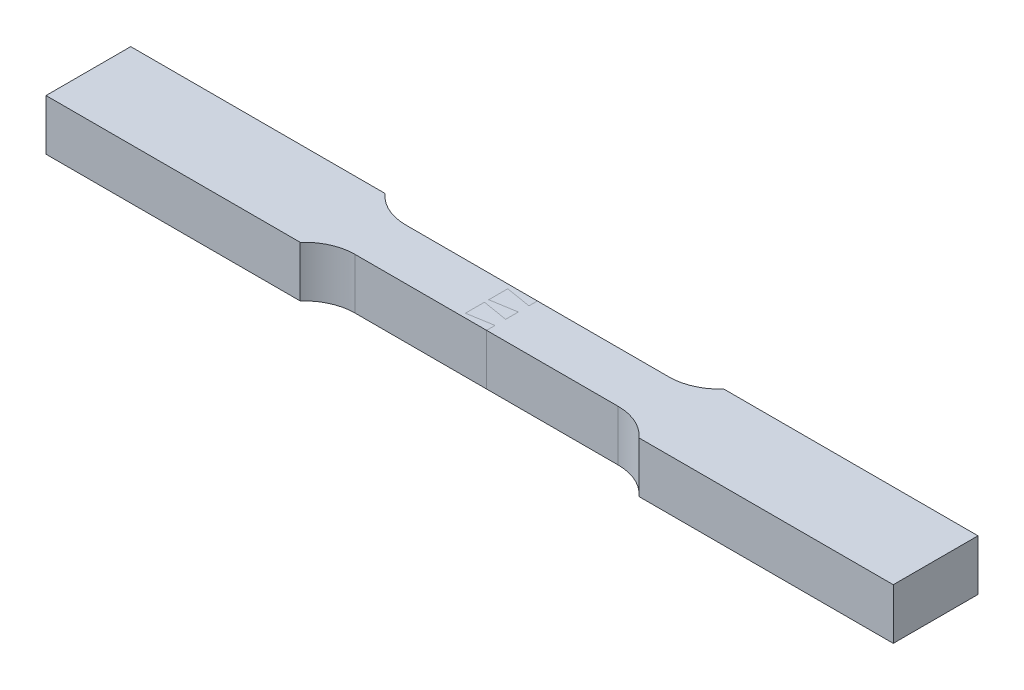
ISO-10303-21;
HEADER;
FILE_DESCRIPTION(('STEP AP214'),'2;1');
FILE_NAME('part.step','',(''),(''),'','','');
FILE_SCHEMA(('AUTOMOTIVE_DESIGN { 1 0 10303 214 1 1 1 1 }'));
ENDSEC;
DATA;
#1=APPLICATION_CONTEXT('core data for automotive mechanical design processes');
#2=APPLICATION_PROTOCOL_DEFINITION('international standard','automotive_design',2000,#1);
#3=PRODUCT_CONTEXT('',#1,'mechanical');
#4=PRODUCT('Part','Part','',(#3));
#5=PRODUCT_RELATED_PRODUCT_CATEGORY('part','',(#4));
#6=PRODUCT_DEFINITION_FORMATION('','',#4);
#7=PRODUCT_DEFINITION_CONTEXT('part definition',#1,'design');
#8=PRODUCT_DEFINITION('design','',#6,#7);
#9=PRODUCT_DEFINITION_SHAPE('','',#8);
#10=(LENGTH_UNIT() NAMED_UNIT(*) SI_UNIT(.MILLI.,.METRE.));
#11=(NAMED_UNIT(*) PLANE_ANGLE_UNIT() SI_UNIT($,.RADIAN.));
#12=(NAMED_UNIT(*) SI_UNIT($,.STERADIAN.) SOLID_ANGLE_UNIT());
#13=UNCERTAINTY_MEASURE_WITH_UNIT(LENGTH_MEASURE(1.E-05),#10,'distance_accuracy_value','');
#14=(GEOMETRIC_REPRESENTATION_CONTEXT(3) GLOBAL_UNCERTAINTY_ASSIGNED_CONTEXT((#13)) GLOBAL_UNIT_ASSIGNED_CONTEXT((#10,
#11,#12)) REPRESENTATION_CONTEXT('',''));
#15=CARTESIAN_POINT('',(0.,0.,0.));
#16=DIRECTION('',(0.,0.,1.));
#17=DIRECTION('',(1.,0.,0.));
#18=AXIS2_PLACEMENT_3D('',#15,#16,#17);
#19=CARTESIAN_POINT('',(15.5278640450004,6.,-9.));
#20=DIRECTION('',(0.,-1.,0.));
#21=DIRECTION('',(0.,0.,-1.));
#22=AXIS2_PLACEMENT_3D('',#19,#20,#21);
#23=CYLINDRICAL_SURFACE('',#22,6.);
#24=CARTESIAN_POINT('',(15.5278640450004,0.,-9.));
#25=DIRECTION('',(0.,1.,0.));
#26=DIRECTION('',(0.,0.,1.));
#27=AXIS2_PLACEMENT_3D('',#24,#25,#26);
#28=CIRCLE('',#27,6.);
#29=CARTESIAN_POINT('',(15.5278640450004,0.,-3.));
#30=VERTEX_POINT('',#29);
#31=CARTESIAN_POINT('',(20.,0.,-5.));
#32=VERTEX_POINT('',#31);
#33=EDGE_CURVE('E199',#30,#32,#28,.T.);
#34=ORIENTED_EDGE('',*,*,#33,.F.);
#35=DIRECTION('',(0.,-1.,0.));
#36=VECTOR('',#35,1.);
#37=CARTESIAN_POINT('',(15.5278640450004,6.,-3.));
#38=LINE('',#37,#36);
#39=CARTESIAN_POINT('',(15.5278640450004,6.,-3.));
#40=VERTEX_POINT('',#39);
#41=EDGE_CURVE('E12',#40,#30,#38,.T.);
#42=ORIENTED_EDGE('',*,*,#41,.F.);
#43=CARTESIAN_POINT('',(15.5278640450004,6.,-9.));
#44=DIRECTION('',(0.,1.,0.));
#45=DIRECTION('',(0.,0.,1.));
#46=AXIS2_PLACEMENT_3D('',#43,#44,#45);
#47=CIRCLE('',#46,6.);
#48=CARTESIAN_POINT('',(20.,6.,-5.));
#49=VERTEX_POINT('',#48);
#50=EDGE_CURVE('E255',#40,#49,#47,.T.);
#51=ORIENTED_EDGE('',*,*,#50,.T.);
#52=DIRECTION('',(0.,-1.,0.));
#53=VECTOR('',#52,1.);
#54=CARTESIAN_POINT('',(20.,6.,-5.));
#55=LINE('',#54,#53);
#56=EDGE_CURVE('E70',#49,#32,#55,.T.);
#57=ORIENTED_EDGE('',*,*,#56,.T.);
#58=EDGE_LOOP('',(#34,#42,#51,#57));
#59=FACE_BOUND('',#58,.T.);
#60=ADVANCED_FACE('F53',(#59),#23,.F.);
#61=CARTESIAN_POINT('',(0.,6.,-3.));
#62=DIRECTION('',(0.,0.,-1.));
#63=DIRECTION('',(-1.,0.,0.));
#64=AXIS2_PLACEMENT_3D('',#61,#62,#63);
#65=PLANE('',#64);
#66=DIRECTION('',(1.,0.,0.));
#67=VECTOR('',#66,1.);
#68=CARTESIAN_POINT('',(0.,0.,-3.));
#69=LINE('',#68,#67);
#70=CARTESIAN_POINT('',(0.,0.,-3.));
#71=VERTEX_POINT('',#70);
#72=EDGE_CURVE('E202',#71,#30,#69,.T.);
#73=ORIENTED_EDGE('',*,*,#72,.F.);
#74=DIRECTION('',(0.,-1.,0.));
#75=VECTOR('',#74,1.);
#76=CARTESIAN_POINT('',(0.,6.,-3.));
#77=LINE('',#76,#75);
#78=CARTESIAN_POINT('',(0.,6.,-3.));
#79=VERTEX_POINT('',#78);
#80=EDGE_CURVE('E62',#79,#71,#77,.T.);
#81=ORIENTED_EDGE('',*,*,#80,.F.);
#82=DIRECTION('',(1.,0.,0.));
#83=VECTOR('',#82,1.);
#84=CARTESIAN_POINT('',(0.,6.,-3.));
#85=LINE('',#84,#83);
#86=EDGE_CURVE('E311',#79,#40,#85,.T.);
#87=ORIENTED_EDGE('',*,*,#86,.T.);
#88=ORIENTED_EDGE('',*,*,#41,.T.);
#89=EDGE_LOOP('',(#73,#81,#87,#88));
#90=FACE_BOUND('',#89,.T.);
#91=ADVANCED_FACE('F310',(#90),#65,.T.);
#92=CARTESIAN_POINT('',(0.,6.,0.));
#93=DIRECTION('',(1.,0.,0.));
#94=DIRECTION('',(0.,0.,-1.));
#95=AXIS2_PLACEMENT_3D('',#92,#93,#94);
#96=PLANE('',#95);
#97=DIRECTION('',(0.,0.,1.));
#98=VECTOR('',#97,1.);
#99=CARTESIAN_POINT('',(0.,0.,0.));
#100=LINE('',#99,#98);
#101=CARTESIAN_POINT('',(0.,0.,-2.));
#102=VERTEX_POINT('',#101);
#103=EDGE_CURVE('E206',#71,#102,#100,.T.);
#104=ORIENTED_EDGE('',*,*,#103,.T.);
#105=DIRECTION('',(0.,-1.,0.));
#106=VECTOR('',#105,1.);
#107=CARTESIAN_POINT('',(0.,6.,-2.));
#108=LINE('',#107,#106);
#109=CARTESIAN_POINT('',(0.,6.,-2.));
#110=VERTEX_POINT('',#109);
#111=EDGE_CURVE('E292',#110,#102,#108,.T.);
#112=ORIENTED_EDGE('',*,*,#111,.F.);
#113=DIRECTION('',(0.,0.,1.));
#114=VECTOR('',#113,1.);
#115=CARTESIAN_POINT('',(0.,6.,0.));
#116=LINE('',#115,#114);
#117=EDGE_CURVE('E301',#79,#110,#116,.T.);
#118=ORIENTED_EDGE('',*,*,#117,.F.);
#119=ORIENTED_EDGE('',*,*,#80,.T.);
#120=EDGE_LOOP('',(#104,#112,#118,#119));
#121=FACE_BOUND('',#120,.T.);
#122=ADVANCED_FACE('F299',(#121),#96,.F.);
#123=CARTESIAN_POINT('',(0.324324324324323,6.,-1.94594594594595));
#124=DIRECTION('',(-0.164398987305356,0.,0.986393923832144));
#125=DIRECTION('',(0.986393923832144,0.,0.164398987305356));
#126=AXIS2_PLACEMENT_3D('',#123,#124,#125);
#127=PLANE('',#126);
#128=DIRECTION('',(-0.986393923832144,0.,-0.164398987305356));
#129=VECTOR('',#128,1.);
#130=CARTESIAN_POINT('',(0.324324324324323,0.,-1.94594594594595));
#131=LINE('',#130,#129);
#132=CARTESIAN_POINT('',(-3.,0.,-2.5));
#133=VERTEX_POINT('',#132);
#134=EDGE_CURVE('E209',#102,#133,#131,.T.);
#135=ORIENTED_EDGE('',*,*,#134,.T.);
#136=DIRECTION('',(0.,-1.,0.));
#137=VECTOR('',#136,1.);
#138=CARTESIAN_POINT('',(-3.,6.,-2.5));
#139=LINE('',#138,#137);
#140=CARTESIAN_POINT('',(-3.,6.,-2.5));
#141=VERTEX_POINT('',#140);
#142=EDGE_CURVE('E288',#141,#133,#139,.T.);
#143=ORIENTED_EDGE('',*,*,#142,.F.);
#144=DIRECTION('',(-0.986393923832144,0.,-0.164398987305356));
#145=VECTOR('',#144,1.);
#146=CARTESIAN_POINT('',(0.324324324324323,6.,-1.94594594594595));
#147=LINE('',#146,#145);
#148=EDGE_CURVE('E506',#110,#141,#147,.T.);
#149=ORIENTED_EDGE('',*,*,#148,.F.);
#150=ORIENTED_EDGE('',*,*,#111,.T.);
#151=EDGE_LOOP('',(#135,#143,#149,#150));
#152=FACE_BOUND('',#151,.T.);
#153=ADVANCED_FACE('F329',(#152),#127,.F.);
#154=CARTESIAN_POINT('',(-3.,6.,0.));
#155=DIRECTION('',(1.,0.,0.));
#156=DIRECTION('',(0.,0.,-1.));
#157=AXIS2_PLACEMENT_3D('',#154,#155,#156);
#158=PLANE('',#157);
#159=DIRECTION('',(0.,0.,1.));
#160=VECTOR('',#159,1.);
#161=CARTESIAN_POINT('',(-3.,0.,0.));
#162=LINE('',#161,#160);
#163=CARTESIAN_POINT('',(-3.,0.,-0.250000000000002));
#164=VERTEX_POINT('',#163);
#165=EDGE_CURVE('E212',#133,#164,#162,.T.);
#166=ORIENTED_EDGE('',*,*,#165,.T.);
#167=DIRECTION('',(0.,-1.,0.));
#168=VECTOR('',#167,1.);
#169=CARTESIAN_POINT('',(-3.,6.,-0.250000000000002));
#170=LINE('',#169,#168);
#171=CARTESIAN_POINT('',(-3.,6.,-0.250000000000002));
#172=VERTEX_POINT('',#171);
#173=EDGE_CURVE('E284',#172,#164,#170,.T.);
#174=ORIENTED_EDGE('',*,*,#173,.F.);
#175=DIRECTION('',(0.,0.,1.));
#176=VECTOR('',#175,1.);
#177=CARTESIAN_POINT('',(-3.,6.,0.));
#178=LINE('',#177,#176);
#179=EDGE_CURVE('E504',#141,#172,#178,.T.);
#180=ORIENTED_EDGE('',*,*,#179,.F.);
#181=ORIENTED_EDGE('',*,*,#142,.T.);
#182=EDGE_LOOP('',(#166,#174,#180,#181));
#183=FACE_BOUND('',#182,.T.);
#184=ADVANCED_FACE('F334',(#183),#158,.F.);
#185=CARTESIAN_POINT('',(-0.121621621621622,6.,-0.729729729729732));
#186=DIRECTION('',(-0.164398987305357,0.,-0.986393923832144));
#187=DIRECTION('',(-0.986393923832144,0.,0.164398987305357));
#188=AXIS2_PLACEMENT_3D('',#185,#186,#187);
#189=PLANE('',#188);
#190=DIRECTION('',(0.986393923832144,0.,-0.164398987305357));
#191=VECTOR('',#190,1.);
#192=CARTESIAN_POINT('',(-0.121621621621622,0.,-0.729729729729732));
#193=LINE('',#192,#191);
#194=CARTESIAN_POINT('',(0.,0.,-0.750000000000002));
#195=VERTEX_POINT('',#194);
#196=EDGE_CURVE('E215',#164,#195,#193,.T.);
#197=ORIENTED_EDGE('',*,*,#196,.T.);
#198=DIRECTION('',(0.,-1.,0.));
#199=VECTOR('',#198,1.);
#200=CARTESIAN_POINT('',(0.,6.,-0.750000000000002));
#201=LINE('',#200,#199);
#202=CARTESIAN_POINT('',(0.,6.,-0.750000000000002));
#203=VERTEX_POINT('',#202);
#204=EDGE_CURVE('E280',#203,#195,#201,.T.);
#205=ORIENTED_EDGE('',*,*,#204,.F.);
#206=DIRECTION('',(0.986393923832144,0.,-0.164398987305357));
#207=VECTOR('',#206,1.);
#208=CARTESIAN_POINT('',(-0.121621621621622,6.,-0.729729729729732));
#209=LINE('',#208,#207);
#210=EDGE_CURVE('E500',#172,#203,#209,.T.);
#211=ORIENTED_EDGE('',*,*,#210,.F.);
#212=ORIENTED_EDGE('',*,*,#173,.T.);
#213=EDGE_LOOP('',(#197,#205,#211,#212));
#214=FACE_BOUND('',#213,.T.);
#215=ADVANCED_FACE('F338',(#214),#189,.F.);
#216=CARTESIAN_POINT('',(0.,6.,0.));
#217=DIRECTION('',(1.,0.,0.));
#218=DIRECTION('',(0.,0.,-1.));
#219=AXIS2_PLACEMENT_3D('',#216,#217,#218);
#220=PLANE('',#219);
#221=DIRECTION('',(0.,0.,1.));
#222=VECTOR('',#221,1.);
#223=CARTESIAN_POINT('',(0.,0.,0.));
#224=LINE('',#223,#222);
#225=CARTESIAN_POINT('',(0.,0.,0.750000000000002));
#226=VERTEX_POINT('',#225);
#227=EDGE_CURVE('E218',#195,#226,#224,.T.);
#228=ORIENTED_EDGE('',*,*,#227,.T.);
#229=DIRECTION('',(0.,-1.,0.));
#230=VECTOR('',#229,1.);
#231=CARTESIAN_POINT('',(0.,6.,0.750000000000002));
#232=LINE('',#231,#230);
#233=CARTESIAN_POINT('',(0.,6.,0.750000000000002));
#234=VERTEX_POINT('',#233);
#235=EDGE_CURVE('E277',#234,#226,#232,.T.);
#236=ORIENTED_EDGE('',*,*,#235,.F.);
#237=DIRECTION('',(0.,0.,1.));
#238=VECTOR('',#237,1.);
#239=CARTESIAN_POINT('',(0.,6.,0.));
#240=LINE('',#239,#238);
#241=EDGE_CURVE('E498',#203,#234,#240,.T.);
#242=ORIENTED_EDGE('',*,*,#241,.F.);
#243=ORIENTED_EDGE('',*,*,#204,.T.);
#244=EDGE_LOOP('',(#228,#236,#242,#243));
#245=FACE_BOUND('',#244,.T.);
#246=ADVANCED_FACE('F342',(#245),#220,.F.);
#247=CARTESIAN_POINT('',(-0.121621621621622,6.,0.729729729729732));
#248=DIRECTION('',(0.164398987305357,0.,-0.986393923832144));
#249=DIRECTION('',(-0.986393923832144,0.,-0.164398987305357));
#250=AXIS2_PLACEMENT_3D('',#247,#248,#249);
#251=PLANE('',#250);
#252=DIRECTION('',(0.986393923832144,0.,0.164398987305357));
#253=VECTOR('',#252,1.);
#254=CARTESIAN_POINT('',(-0.121621621621622,0.,0.729729729729732));
#255=LINE('',#254,#253);
#256=CARTESIAN_POINT('',(-3.,0.,0.250000000000002));
#257=VERTEX_POINT('',#256);
#258=EDGE_CURVE('E222',#257,#226,#255,.T.);
#259=ORIENTED_EDGE('',*,*,#258,.F.);
#260=DIRECTION('',(0.,-1.,0.));
#261=VECTOR('',#260,1.);
#262=CARTESIAN_POINT('',(-3.,6.,0.250000000000002));
#263=LINE('',#262,#261);
#264=CARTESIAN_POINT('',(-3.,6.,0.250000000000002));
#265=VERTEX_POINT('',#264);
#266=EDGE_CURVE('E274',#265,#257,#263,.T.);
#267=ORIENTED_EDGE('',*,*,#266,.F.);
#268=DIRECTION('',(0.986393923832144,0.,0.164398987305357));
#269=VECTOR('',#268,1.);
#270=CARTESIAN_POINT('',(-0.121621621621622,6.,0.729729729729732));
#271=LINE('',#270,#269);
#272=EDGE_CURVE('E495',#265,#234,#271,.T.);
#273=ORIENTED_EDGE('',*,*,#272,.T.);
#274=ORIENTED_EDGE('',*,*,#235,.T.);
#275=EDGE_LOOP('',(#259,#267,#273,#274));
#276=FACE_BOUND('',#275,.T.);
#277=ADVANCED_FACE('F346',(#276),#251,.T.);
#278=CARTESIAN_POINT('',(-3.,6.,0.));
#279=DIRECTION('',(-1.,0.,0.));
#280=DIRECTION('',(0.,0.,1.));
#281=AXIS2_PLACEMENT_3D('',#278,#279,#280);
#282=PLANE('',#281);
#283=DIRECTION('',(0.,0.,-1.));
#284=VECTOR('',#283,1.);
#285=CARTESIAN_POINT('',(-3.,0.,0.));
#286=LINE('',#285,#284);
#287=CARTESIAN_POINT('',(-3.,0.,2.5));
#288=VERTEX_POINT('',#287);
#289=EDGE_CURVE('E226',#288,#257,#286,.T.);
#290=ORIENTED_EDGE('',*,*,#289,.F.);
#291=DIRECTION('',(0.,-1.,0.));
#292=VECTOR('',#291,1.);
#293=CARTESIAN_POINT('',(-3.,6.,2.5));
#294=LINE('',#293,#292);
#295=CARTESIAN_POINT('',(-3.,6.,2.5));
#296=VERTEX_POINT('',#295);
#297=EDGE_CURVE('E271',#296,#288,#294,.T.);
#298=ORIENTED_EDGE('',*,*,#297,.F.);
#299=DIRECTION('',(0.,0.,-1.));
#300=VECTOR('',#299,1.);
#301=CARTESIAN_POINT('',(-3.,6.,0.));
#302=LINE('',#301,#300);
#303=EDGE_CURVE('E521',#296,#265,#302,.T.);
#304=ORIENTED_EDGE('',*,*,#303,.T.);
#305=ORIENTED_EDGE('',*,*,#266,.T.);
#306=EDGE_LOOP('',(#290,#298,#304,#305));
#307=FACE_BOUND('',#306,.T.);
#308=ADVANCED_FACE('F350',(#307),#282,.T.);
#309=CARTESIAN_POINT('',(0.324324324324323,6.,1.94594594594595));
#310=DIRECTION('',(0.164398987305356,0.,0.986393923832144));
#311=DIRECTION('',(0.986393923832144,0.,-0.164398987305356));
#312=AXIS2_PLACEMENT_3D('',#309,#310,#311);
#313=PLANE('',#312);
#314=DIRECTION('',(-0.986393923832144,0.,0.164398987305356));
#315=VECTOR('',#314,1.);
#316=CARTESIAN_POINT('',(0.324324324324323,0.,1.94594594594595));
#317=LINE('',#316,#315);
#318=CARTESIAN_POINT('',(0.,0.,2.));
#319=VERTEX_POINT('',#318);
#320=EDGE_CURVE('E230',#319,#288,#317,.T.);
#321=ORIENTED_EDGE('',*,*,#320,.F.);
#322=DIRECTION('',(0.,-1.,0.));
#323=VECTOR('',#322,1.);
#324=CARTESIAN_POINT('',(0.,6.,2.));
#325=LINE('',#324,#323);
#326=CARTESIAN_POINT('',(0.,6.,2.));
#327=VERTEX_POINT('',#326);
#328=EDGE_CURVE('E268',#327,#319,#325,.T.);
#329=ORIENTED_EDGE('',*,*,#328,.F.);
#330=DIRECTION('',(-0.986393923832144,0.,0.164398987305356));
#331=VECTOR('',#330,1.);
#332=CARTESIAN_POINT('',(0.324324324324323,6.,1.94594594594595));
#333=LINE('',#332,#331);
#334=EDGE_CURVE('E486',#327,#296,#333,.T.);
#335=ORIENTED_EDGE('',*,*,#334,.T.);
#336=ORIENTED_EDGE('',*,*,#297,.T.);
#337=EDGE_LOOP('',(#321,#329,#335,#336));
#338=FACE_BOUND('',#337,.T.);
#339=ADVANCED_FACE('F354',(#338),#313,.T.);
#340=CARTESIAN_POINT('',(0.,6.,0.));
#341=DIRECTION('',(1.,0.,0.));
#342=DIRECTION('',(0.,0.,-1.));
#343=AXIS2_PLACEMENT_3D('',#340,#341,#342);
#344=PLANE('',#343);
#345=DIRECTION('',(0.,0.,1.));
#346=VECTOR('',#345,1.);
#347=CARTESIAN_POINT('',(0.,0.,0.));
#348=LINE('',#347,#346);
#349=CARTESIAN_POINT('',(0.,0.,3.));
#350=VERTEX_POINT('',#349);
#351=EDGE_CURVE('E234',#319,#350,#348,.T.);
#352=ORIENTED_EDGE('',*,*,#351,.T.);
#353=DIRECTION('',(0.,-1.,0.));
#354=VECTOR('',#353,1.);
#355=CARTESIAN_POINT('',(0.,6.,3.));
#356=LINE('',#355,#354);
#357=CARTESIAN_POINT('',(0.,6.,3.));
#358=VERTEX_POINT('',#357);
#359=EDGE_CURVE('E265',#358,#350,#356,.T.);
#360=ORIENTED_EDGE('',*,*,#359,.F.);
#361=DIRECTION('',(0.,0.,1.));
#362=VECTOR('',#361,1.);
#363=CARTESIAN_POINT('',(0.,6.,0.));
#364=LINE('',#363,#362);
#365=EDGE_CURVE('E526',#327,#358,#364,.T.);
#366=ORIENTED_EDGE('',*,*,#365,.F.);
#367=ORIENTED_EDGE('',*,*,#328,.T.);
#368=EDGE_LOOP('',(#352,#360,#366,#367));
#369=FACE_BOUND('',#368,.T.);
#370=ADVANCED_FACE('F358',(#369),#344,.F.);
#371=CARTESIAN_POINT('',(0.,6.,3.));
#372=DIRECTION('',(0.,0.,1.));
#373=DIRECTION('',(1.,0.,0.));
#374=AXIS2_PLACEMENT_3D('',#371,#372,#373);
#375=PLANE('',#374);
#376=DIRECTION('',(-1.,0.,0.));
#377=VECTOR('',#376,1.);
#378=CARTESIAN_POINT('',(0.,0.,3.));
#379=LINE('',#378,#377);
#380=CARTESIAN_POINT('',(15.5278640450004,0.,3.));
#381=VERTEX_POINT('',#380);
#382=EDGE_CURVE('E238',#381,#350,#379,.T.);
#383=ORIENTED_EDGE('',*,*,#382,.F.);
#384=DIRECTION('',(0.,-1.,0.));
#385=VECTOR('',#384,1.);
#386=CARTESIAN_POINT('',(15.5278640450004,6.,3.));
#387=LINE('',#386,#385);
#388=CARTESIAN_POINT('',(15.5278640450004,6.,3.));
#389=VERTEX_POINT('',#388);
#390=EDGE_CURVE('E262',#389,#381,#387,.T.);
#391=ORIENTED_EDGE('',*,*,#390,.F.);
#392=DIRECTION('',(-1.,0.,0.));
#393=VECTOR('',#392,1.);
#394=CARTESIAN_POINT('',(0.,6.,3.));
#395=LINE('',#394,#393);
#396=EDGE_CURVE('E480',#389,#358,#395,.T.);
#397=ORIENTED_EDGE('',*,*,#396,.T.);
#398=ORIENTED_EDGE('',*,*,#359,.T.);
#399=EDGE_LOOP('',(#383,#391,#397,#398));
#400=FACE_BOUND('',#399,.T.);
#401=ADVANCED_FACE('F362',(#400),#375,.T.);
#402=CARTESIAN_POINT('',(15.5278640450004,6.,9.));
#403=DIRECTION('',(0.,-1.,0.));
#404=DIRECTION('',(0.,0.,-1.));
#405=AXIS2_PLACEMENT_3D('',#402,#403,#404);
#406=CYLINDRICAL_SURFACE('',#405,6.);
#407=CARTESIAN_POINT('',(15.5278640450004,0.,9.));
#408=DIRECTION('',(0.,1.,0.));
#409=DIRECTION('',(0.,0.,1.));
#410=AXIS2_PLACEMENT_3D('',#407,#408,#409);
#411=CIRCLE('',#410,6.);
#412=CARTESIAN_POINT('',(20.,0.,5.));
#413=VERTEX_POINT('',#412);
#414=EDGE_CURVE('E242',#381,#413,#411,.F.);
#415=ORIENTED_EDGE('',*,*,#414,.T.);
#416=DIRECTION('',(0.,-1.,0.));
#417=VECTOR('',#416,1.);
#418=CARTESIAN_POINT('',(20.,6.,5.));
#419=LINE('',#418,#417);
#420=CARTESIAN_POINT('',(20.,6.,5.));
#421=VERTEX_POINT('',#420);
#422=EDGE_CURVE('E178',#421,#413,#419,.T.);
#423=ORIENTED_EDGE('',*,*,#422,.F.);
#424=CARTESIAN_POINT('',(15.5278640450004,6.,9.));
#425=DIRECTION('',(0.,1.,0.));
#426=DIRECTION('',(0.,0.,1.));
#427=AXIS2_PLACEMENT_3D('',#424,#425,#426);
#428=CIRCLE('',#427,6.);
#429=EDGE_CURVE('E187',#389,#421,#428,.F.);
#430=ORIENTED_EDGE('',*,*,#429,.F.);
#431=ORIENTED_EDGE('',*,*,#390,.T.);
#432=EDGE_LOOP('',(#415,#423,#430,#431));
#433=FACE_BOUND('',#432,.T.);
#434=ADVANCED_FACE('F366',(#433),#406,.F.);
#435=CARTESIAN_POINT('',(0.,6.,5.));
#436=DIRECTION('',(0.,0.,1.));
#437=DIRECTION('',(1.,0.,0.));
#438=AXIS2_PLACEMENT_3D('',#435,#436,#437);
#439=PLANE('',#438);
#440=DIRECTION('',(-1.,0.,0.));
#441=VECTOR('',#440,1.);
#442=CARTESIAN_POINT('',(0.,0.,5.));
#443=LINE('',#442,#441);
#444=CARTESIAN_POINT('',(50.,0.,5.00000000000001));
#445=VERTEX_POINT('',#444);
#446=EDGE_CURVE('E173',#445,#413,#443,.T.);
#447=ORIENTED_EDGE('',*,*,#446,.F.);
#448=DIRECTION('',(0.,-1.,0.));
#449=VECTOR('',#448,1.);
#450=CARTESIAN_POINT('',(50.,6.,5.00000000000001));
#451=LINE('',#450,#449);
#452=CARTESIAN_POINT('',(50.,6.,5.00000000000001));
#453=VERTEX_POINT('',#452);
#454=EDGE_CURVE('E168',#453,#445,#451,.T.);
#455=ORIENTED_EDGE('',*,*,#454,.F.);
#456=DIRECTION('',(-1.,0.,0.));
#457=VECTOR('',#456,1.);
#458=CARTESIAN_POINT('',(0.,6.,5.));
#459=LINE('',#458,#457);
#460=EDGE_CURVE('E171',#453,#421,#459,.T.);
#461=ORIENTED_EDGE('',*,*,#460,.T.);
#462=ORIENTED_EDGE('',*,*,#422,.T.);
#463=EDGE_LOOP('',(#447,#455,#461,#462));
#464=FACE_BOUND('',#463,.T.);
#465=ADVANCED_FACE('F170',(#464),#439,.T.);
#466=CARTESIAN_POINT('',(50.,6.,0.));
#467=DIRECTION('',(1.,0.,0.));
#468=DIRECTION('',(0.,0.,-1.));
#469=AXIS2_PLACEMENT_3D('',#466,#467,#468);
#470=PLANE('',#469);
#471=DIRECTION('',(0.,0.,1.));
#472=VECTOR('',#471,1.);
#473=CARTESIAN_POINT('',(50.,0.,0.));
#474=LINE('',#473,#472);
#475=CARTESIAN_POINT('',(50.,0.,-5.));
#476=VERTEX_POINT('',#475);
#477=EDGE_CURVE('E248',#476,#445,#474,.T.);
#478=ORIENTED_EDGE('',*,*,#477,.F.);
#479=DIRECTION('',(0.,-1.,0.));
#480=VECTOR('',#479,1.);
#481=CARTESIAN_POINT('',(50.,6.,-5.));
#482=LINE('',#481,#480);
#483=CARTESIAN_POINT('',(50.,6.,-5.));
#484=VERTEX_POINT('',#483);
#485=EDGE_CURVE('E119',#484,#476,#482,.T.);
#486=ORIENTED_EDGE('',*,*,#485,.F.);
#487=DIRECTION('',(0.,0.,1.));
#488=VECTOR('',#487,1.);
#489=CARTESIAN_POINT('',(50.,6.,0.));
#490=LINE('',#489,#488);
#491=EDGE_CURVE('E184',#484,#453,#490,.T.);
#492=ORIENTED_EDGE('',*,*,#491,.T.);
#493=ORIENTED_EDGE('',*,*,#454,.T.);
#494=EDGE_LOOP('',(#478,#486,#492,#493));
#495=FACE_BOUND('',#494,.T.);
#496=ADVANCED_FACE('F191',(#495),#470,.T.);
#497=CARTESIAN_POINT('',(0.,6.,-5.00000000000001));
#498=DIRECTION('',(0.,0.,-1.));
#499=DIRECTION('',(-1.,0.,0.));
#500=AXIS2_PLACEMENT_3D('',#497,#498,#499);
#501=PLANE('',#500);
#502=DIRECTION('',(1.,0.,0.));
#503=VECTOR('',#502,1.);
#504=CARTESIAN_POINT('',(0.,0.,-5.00000000000001));
#505=LINE('',#504,#503);
#506=EDGE_CURVE('E251',#32,#476,#505,.T.);
#507=ORIENTED_EDGE('',*,*,#506,.F.);
#508=ORIENTED_EDGE('',*,*,#56,.F.);
#509=DIRECTION('',(1.,0.,0.));
#510=VECTOR('',#509,1.);
#511=CARTESIAN_POINT('',(0.,6.,-5.00000000000001));
#512=LINE('',#511,#510);
#513=EDGE_CURVE('E193',#49,#484,#512,.T.);
#514=ORIENTED_EDGE('',*,*,#513,.T.);
#515=ORIENTED_EDGE('',*,*,#485,.T.);
#516=EDGE_LOOP('',(#507,#508,#514,#515));
#517=FACE_BOUND('',#516,.T.);
#518=ADVANCED_FACE('F312',(#517),#501,.T.);
#519=CARTESIAN_POINT('',(0.,6.,0.));
#520=DIRECTION('',(0.,1.,0.));
#521=DIRECTION('',(0.,0.,1.));
#522=AXIS2_PLACEMENT_3D('',#519,#520,#521);
#523=PLANE('',#522);
#524=ORIENTED_EDGE('',*,*,#50,.F.);
#525=ORIENTED_EDGE('',*,*,#86,.F.);
#526=ORIENTED_EDGE('',*,*,#117,.T.);
#527=ORIENTED_EDGE('',*,*,#148,.T.);
#528=ORIENTED_EDGE('',*,*,#179,.T.);
#529=ORIENTED_EDGE('',*,*,#210,.T.);
#530=ORIENTED_EDGE('',*,*,#241,.T.);
#531=ORIENTED_EDGE('',*,*,#272,.F.);
#532=ORIENTED_EDGE('',*,*,#303,.F.);
#533=ORIENTED_EDGE('',*,*,#334,.F.);
#534=ORIENTED_EDGE('',*,*,#365,.T.);
#535=ORIENTED_EDGE('',*,*,#396,.F.);
#536=ORIENTED_EDGE('',*,*,#429,.T.);
#537=ORIENTED_EDGE('',*,*,#460,.F.);
#538=ORIENTED_EDGE('',*,*,#491,.F.);
#539=ORIENTED_EDGE('',*,*,#513,.F.);
#540=EDGE_LOOP('',(#524,#525,#526,#527,#528,#529,#530,#531,#532,#533,#534,#535,#536,#537,#538,#539));
#541=FACE_BOUND('',#540,.T.);
#542=ADVANCED_FACE('F182',(#541),#523,.T.);
#543=CARTESIAN_POINT('',(0.,0.,0.));
#544=DIRECTION('',(0.,1.,0.));
#545=DIRECTION('',(0.,0.,1.));
#546=AXIS2_PLACEMENT_3D('',#543,#544,#545);
#547=PLANE('',#546);
#548=ORIENTED_EDGE('',*,*,#33,.T.);
#549=ORIENTED_EDGE('',*,*,#506,.T.);
#550=ORIENTED_EDGE('',*,*,#477,.T.);
#551=ORIENTED_EDGE('',*,*,#446,.T.);
#552=ORIENTED_EDGE('',*,*,#414,.F.);
#553=ORIENTED_EDGE('',*,*,#382,.T.);
#554=ORIENTED_EDGE('',*,*,#351,.F.);
#555=ORIENTED_EDGE('',*,*,#320,.T.);
#556=ORIENTED_EDGE('',*,*,#289,.T.);
#557=ORIENTED_EDGE('',*,*,#258,.T.);
#558=ORIENTED_EDGE('',*,*,#227,.F.);
#559=ORIENTED_EDGE('',*,*,#196,.F.);
#560=ORIENTED_EDGE('',*,*,#165,.F.);
#561=ORIENTED_EDGE('',*,*,#134,.F.);
#562=ORIENTED_EDGE('',*,*,#103,.F.);
#563=ORIENTED_EDGE('',*,*,#72,.T.);
#564=EDGE_LOOP('',(#548,#549,#550,#551,#552,#553,#554,#555,#556,#557,#558,#559,#560,#561,#562,#563));
#565=FACE_BOUND('',#564,.T.);
#566=ADVANCED_FACE('F308',(#565),#547,.F.);
#567=CLOSED_SHELL('',(#60,#91,#122,#153,#184,#215,#246,#277,#308,#339,#370,#401,#434,#465,#496,
#518,#542,#566));
#568=MANIFOLD_SOLID_BREP('B2',#567);
#569=CARTESIAN_POINT('',(-15.5278640450004,6.,9.));
#570=DIRECTION('',(0.,-1.,0.));
#571=DIRECTION('',(0.,0.,-1.));
#572=AXIS2_PLACEMENT_3D('',#569,#570,#571);
#573=CYLINDRICAL_SURFACE('',#572,6.);
#574=CARTESIAN_POINT('',(-15.5278640450004,0.,9.));
#575=DIRECTION('',(0.,1.,0.));
#576=DIRECTION('',(0.,0.,1.));
#577=AXIS2_PLACEMENT_3D('',#574,#575,#576);
#578=CIRCLE('',#577,6.);
#579=CARTESIAN_POINT('',(-15.5278640450004,0.,3.));
#580=VERTEX_POINT('',#579);
#581=CARTESIAN_POINT('',(-20.,0.,5.));
#582=VERTEX_POINT('',#581);
#583=EDGE_CURVE('E678',#580,#582,#578,.T.);
#584=ORIENTED_EDGE('',*,*,#583,.F.);
#585=DIRECTION('',(0.,-1.,0.));
#586=VECTOR('',#585,1.);
#587=CARTESIAN_POINT('',(-15.5278640450004,6.,3.));
#588=LINE('',#587,#586);
#589=CARTESIAN_POINT('',(-15.5278640450004,6.,3.));
#590=VERTEX_POINT('',#589);
#591=EDGE_CURVE('E51',#590,#580,#588,.T.);
#592=ORIENTED_EDGE('',*,*,#591,.F.);
#593=CARTESIAN_POINT('',(-15.5278640450004,6.,9.));
#594=DIRECTION('',(0.,1.,0.));
#595=DIRECTION('',(0.,0.,1.));
#596=AXIS2_PLACEMENT_3D('',#593,#594,#595);
#597=CIRCLE('',#596,6.);
#598=CARTESIAN_POINT('',(-20.,6.,5.));
#599=VERTEX_POINT('',#598);
#600=EDGE_CURVE('E718',#590,#599,#597,.T.);
#601=ORIENTED_EDGE('',*,*,#600,.T.);
#602=DIRECTION('',(0.,-1.,0.));
#603=VECTOR('',#602,1.);
#604=CARTESIAN_POINT('',(-20.,6.,5.));
#605=LINE('',#604,#603);
#606=EDGE_CURVE('E612',#599,#582,#605,.T.);
#607=ORIENTED_EDGE('',*,*,#606,.T.);
#608=EDGE_LOOP('',(#584,#592,#601,#607));
#609=FACE_BOUND('',#608,.T.);
#610=ADVANCED_FACE('F537',(#609),#573,.F.);
#611=CARTESIAN_POINT('',(0.,6.,3.));
#612=DIRECTION('',(0.,0.,1.));
#613=DIRECTION('',(1.,0.,0.));
#614=AXIS2_PLACEMENT_3D('',#611,#612,#613);
#615=PLANE('',#614);
#616=DIRECTION('',(-1.,0.,0.));
#617=VECTOR('',#616,1.);
#618=CARTESIAN_POINT('',(0.,0.,3.));
#619=LINE('',#618,#617);
#620=CARTESIAN_POINT('',(0.,0.,3.));
#621=VERTEX_POINT('',#620);
#622=EDGE_CURVE('E681',#621,#580,#619,.T.);
#623=ORIENTED_EDGE('',*,*,#622,.F.);
#624=DIRECTION('',(0.,-1.,0.));
#625=VECTOR('',#624,1.);
#626=CARTESIAN_POINT('',(0.,6.,3.));
#627=LINE('',#626,#625);
#628=CARTESIAN_POINT('',(0.,6.,3.));
#629=VERTEX_POINT('',#628);
#630=EDGE_CURVE('E545',#629,#621,#627,.T.);
#631=ORIENTED_EDGE('',*,*,#630,.F.);
#632=DIRECTION('',(-1.,0.,0.));
#633=VECTOR('',#632,1.);
#634=CARTESIAN_POINT('',(0.,6.,3.));
#635=LINE('',#634,#633);
#636=EDGE_CURVE('E821',#629,#590,#635,.T.);
#637=ORIENTED_EDGE('',*,*,#636,.T.);
#638=ORIENTED_EDGE('',*,*,#591,.T.);
#639=EDGE_LOOP('',(#623,#631,#637,#638));
#640=FACE_BOUND('',#639,.T.);
#641=ADVANCED_FACE('F753',(#640),#615,.T.);
#642=CARTESIAN_POINT('',(0.,6.,0.));
#643=DIRECTION('',(1.,0.,0.));
#644=DIRECTION('',(0.,0.,-1.));
#645=AXIS2_PLACEMENT_3D('',#642,#643,#644);
#646=PLANE('',#645);
#647=DIRECTION('',(0.,0.,1.));
#648=VECTOR('',#647,1.);
#649=CARTESIAN_POINT('',(0.,0.,0.));
#650=LINE('',#649,#648);
#651=CARTESIAN_POINT('',(0.,0.,2.));
#652=VERTEX_POINT('',#651);
#653=EDGE_CURVE('E684',#652,#621,#650,.T.);
#654=ORIENTED_EDGE('',*,*,#653,.F.);
#655=DIRECTION('',(0.,-1.,0.));
#656=VECTOR('',#655,1.);
#657=CARTESIAN_POINT('',(0.,6.,2.));
#658=LINE('',#657,#656);
#659=CARTESIAN_POINT('',(0.,6.,2.));
#660=VERTEX_POINT('',#659);
#661=EDGE_CURVE('E742',#660,#652,#658,.T.);
#662=ORIENTED_EDGE('',*,*,#661,.F.);
#663=DIRECTION('',(0.,0.,1.));
#664=VECTOR('',#663,1.);
#665=CARTESIAN_POINT('',(0.,6.,0.));
#666=LINE('',#665,#664);
#667=EDGE_CURVE('E749',#660,#629,#666,.T.);
#668=ORIENTED_EDGE('',*,*,#667,.T.);
#669=ORIENTED_EDGE('',*,*,#630,.T.);
#670=EDGE_LOOP('',(#654,#662,#668,#669));
#671=FACE_BOUND('',#670,.T.);
#672=ADVANCED_FACE('F747',(#671),#646,.T.);
#673=CARTESIAN_POINT('',(0.324324324324323,6.,1.94594594594595));
#674=DIRECTION('',(0.164398987305356,0.,0.986393923832144));
#675=DIRECTION('',(0.986393923832144,0.,-0.164398987305356));
#676=AXIS2_PLACEMENT_3D('',#673,#674,#675);
#677=PLANE('',#676);
#678=DIRECTION('',(-0.986393923832144,0.,0.164398987305356));
#679=VECTOR('',#678,1.);
#680=CARTESIAN_POINT('',(0.324324324324323,0.,1.94594594594595));
#681=LINE('',#680,#679);
#682=CARTESIAN_POINT('',(-3.,0.,2.5));
#683=VERTEX_POINT('',#682);
#684=EDGE_CURVE('E687',#652,#683,#681,.T.);
#685=ORIENTED_EDGE('',*,*,#684,.T.);
#686=DIRECTION('',(0.,-1.,0.));
#687=VECTOR('',#686,1.);
#688=CARTESIAN_POINT('',(-3.,6.,2.5));
#689=LINE('',#688,#687);
#690=CARTESIAN_POINT('',(-3.,6.,2.5));
#691=VERTEX_POINT('',#690);
#692=EDGE_CURVE('E739',#691,#683,#689,.T.);
#693=ORIENTED_EDGE('',*,*,#692,.F.);
#694=DIRECTION('',(-0.986393923832144,0.,0.164398987305356));
#695=VECTOR('',#694,1.);
#696=CARTESIAN_POINT('',(0.324324324324323,6.,1.94594594594595));
#697=LINE('',#696,#695);
#698=EDGE_CURVE('E770',#660,#691,#697,.T.);
#699=ORIENTED_EDGE('',*,*,#698,.F.);
#700=ORIENTED_EDGE('',*,*,#661,.T.);
#701=EDGE_LOOP('',(#685,#693,#699,#700));
#702=FACE_BOUND('',#701,.T.);
#703=ADVANCED_FACE('F761',(#702),#677,.F.);
#704=CARTESIAN_POINT('',(-3.,6.,0.));
#705=DIRECTION('',(-1.,0.,0.));
#706=DIRECTION('',(0.,0.,1.));
#707=AXIS2_PLACEMENT_3D('',#704,#705,#706);
#708=PLANE('',#707);
#709=DIRECTION('',(0.,0.,-1.));
#710=VECTOR('',#709,1.);
#711=CARTESIAN_POINT('',(-3.,0.,0.));
#712=LINE('',#711,#710);
#713=CARTESIAN_POINT('',(-3.,0.,0.250000000000002));
#714=VERTEX_POINT('',#713);
#715=EDGE_CURVE('E689',#683,#714,#712,.T.);
#716=ORIENTED_EDGE('',*,*,#715,.T.);
#717=DIRECTION('',(0.,-1.,0.));
#718=VECTOR('',#717,1.);
#719=CARTESIAN_POINT('',(-3.,6.,0.250000000000002));
#720=LINE('',#719,#718);
#721=CARTESIAN_POINT('',(-3.,6.,0.250000000000002));
#722=VERTEX_POINT('',#721);
#723=EDGE_CURVE('E736',#722,#714,#720,.T.);
#724=ORIENTED_EDGE('',*,*,#723,.F.);
#725=DIRECTION('',(0.,0.,-1.));
#726=VECTOR('',#725,1.);
#727=CARTESIAN_POINT('',(-3.,6.,0.));
#728=LINE('',#727,#726);
#729=EDGE_CURVE('E767',#691,#722,#728,.T.);
#730=ORIENTED_EDGE('',*,*,#729,.F.);
#731=ORIENTED_EDGE('',*,*,#692,.T.);
#732=EDGE_LOOP('',(#716,#724,#730,#731));
#733=FACE_BOUND('',#732,.T.);
#734=ADVANCED_FACE('F765',(#733),#708,.F.);
#735=CARTESIAN_POINT('',(-0.121621621621622,6.,0.729729729729732));
#736=DIRECTION('',(0.164398987305357,0.,-0.986393923832144));
#737=DIRECTION('',(-0.986393923832144,0.,-0.164398987305357));
#738=AXIS2_PLACEMENT_3D('',#735,#736,#737);
#739=PLANE('',#738);
#740=DIRECTION('',(0.986393923832144,0.,0.164398987305357));
#741=VECTOR('',#740,1.);
#742=CARTESIAN_POINT('',(-0.121621621621622,0.,0.729729729729732));
#743=LINE('',#742,#741);
#744=CARTESIAN_POINT('',(0.,0.,0.750000000000002));
#745=VERTEX_POINT('',#744);
#746=EDGE_CURVE('E691',#714,#745,#743,.T.);
#747=ORIENTED_EDGE('',*,*,#746,.T.);
#748=DIRECTION('',(0.,-1.,0.));
#749=VECTOR('',#748,1.);
#750=CARTESIAN_POINT('',(0.,6.,0.750000000000002));
#751=LINE('',#750,#749);
#752=CARTESIAN_POINT('',(0.,6.,0.750000000000002));
#753=VERTEX_POINT('',#752);
#754=EDGE_CURVE('E734',#753,#745,#751,.T.);
#755=ORIENTED_EDGE('',*,*,#754,.F.);
#756=DIRECTION('',(0.986393923832144,0.,0.164398987305357));
#757=VECTOR('',#756,1.);
#758=CARTESIAN_POINT('',(-0.121621621621622,6.,0.729729729729732));
#759=LINE('',#758,#757);
#760=EDGE_CURVE('E769',#722,#753,#759,.T.);
#761=ORIENTED_EDGE('',*,*,#760,.F.);
#762=ORIENTED_EDGE('',*,*,#723,.T.);
#763=EDGE_LOOP('',(#747,#755,#761,#762));
#764=FACE_BOUND('',#763,.T.);
#765=ADVANCED_FACE('F914',(#764),#739,.F.);
#766=CARTESIAN_POINT('',(0.,6.,0.));
#767=DIRECTION('',(1.,0.,0.));
#768=DIRECTION('',(0.,0.,-1.));
#769=AXIS2_PLACEMENT_3D('',#766,#767,#768);
#770=PLANE('',#769);
#771=DIRECTION('',(0.,0.,1.));
#772=VECTOR('',#771,1.);
#773=CARTESIAN_POINT('',(0.,0.,0.));
#774=LINE('',#773,#772);
#775=CARTESIAN_POINT('',(0.,0.,-0.750000000000002));
#776=VERTEX_POINT('',#775);
#777=EDGE_CURVE('E694',#776,#745,#774,.T.);
#778=ORIENTED_EDGE('',*,*,#777,.F.);
#779=DIRECTION('',(0.,-1.,0.));
#780=VECTOR('',#779,1.);
#781=CARTESIAN_POINT('',(0.,6.,-0.750000000000002));
#782=LINE('',#781,#780);
#783=CARTESIAN_POINT('',(0.,6.,-0.750000000000002));
#784=VERTEX_POINT('',#783);
#785=EDGE_CURVE('E732',#784,#776,#782,.T.);
#786=ORIENTED_EDGE('',*,*,#785,.F.);
#787=DIRECTION('',(0.,0.,1.));
#788=VECTOR('',#787,1.);
#789=CARTESIAN_POINT('',(0.,6.,0.));
#790=LINE('',#789,#788);
#791=EDGE_CURVE('E772',#784,#753,#790,.T.);
#792=ORIENTED_EDGE('',*,*,#791,.T.);
#793=ORIENTED_EDGE('',*,*,#754,.T.);
#794=EDGE_LOOP('',(#778,#786,#792,#793));
#795=FACE_BOUND('',#794,.T.);
#796=ADVANCED_FACE('F904',(#795),#770,.T.);
#797=CARTESIAN_POINT('',(-0.121621621621622,6.,-0.729729729729732));
#798=DIRECTION('',(-0.164398987305357,0.,-0.986393923832144));
#799=DIRECTION('',(-0.986393923832144,0.,0.164398987305357));
#800=AXIS2_PLACEMENT_3D('',#797,#798,#799);
#801=PLANE('',#800);
#802=DIRECTION('',(0.986393923832144,0.,-0.164398987305357));
#803=VECTOR('',#802,1.);
#804=CARTESIAN_POINT('',(-0.121621621621622,0.,-0.729729729729732));
#805=LINE('',#804,#803);
#806=CARTESIAN_POINT('',(-3.,0.,-0.250000000000002));
#807=VERTEX_POINT('',#806);
#808=EDGE_CURVE('E697',#807,#776,#805,.T.);
#809=ORIENTED_EDGE('',*,*,#808,.F.);
#810=DIRECTION('',(0.,-1.,0.));
#811=VECTOR('',#810,1.);
#812=CARTESIAN_POINT('',(-3.,6.,-0.250000000000002));
#813=LINE('',#812,#811);
#814=CARTESIAN_POINT('',(-3.,6.,-0.250000000000002));
#815=VERTEX_POINT('',#814);
#816=EDGE_CURVE('E730',#815,#807,#813,.T.);
#817=ORIENTED_EDGE('',*,*,#816,.F.);
#818=DIRECTION('',(0.986393923832144,0.,-0.164398987305357));
#819=VECTOR('',#818,1.);
#820=CARTESIAN_POINT('',(-0.121621621621622,6.,-0.729729729729732));
#821=LINE('',#820,#819);
#822=EDGE_CURVE('E779',#815,#784,#821,.T.);
#823=ORIENTED_EDGE('',*,*,#822,.T.);
#824=ORIENTED_EDGE('',*,*,#785,.T.);
#825=EDGE_LOOP('',(#809,#817,#823,#824));
#826=FACE_BOUND('',#825,.T.);
#827=ADVANCED_FACE('F894',(#826),#801,.T.);
#828=CARTESIAN_POINT('',(-3.,6.,0.));
#829=DIRECTION('',(1.,0.,0.));
#830=DIRECTION('',(0.,0.,-1.));
#831=AXIS2_PLACEMENT_3D('',#828,#829,#830);
#832=PLANE('',#831);
#833=DIRECTION('',(0.,0.,1.));
#834=VECTOR('',#833,1.);
#835=CARTESIAN_POINT('',(-3.,0.,0.));
#836=LINE('',#835,#834);
#837=CARTESIAN_POINT('',(-3.,0.,-2.5));
#838=VERTEX_POINT('',#837);
#839=EDGE_CURVE('E700',#838,#807,#836,.T.);
#840=ORIENTED_EDGE('',*,*,#839,.F.);
#841=DIRECTION('',(0.,-1.,0.));
#842=VECTOR('',#841,1.);
#843=CARTESIAN_POINT('',(-3.,6.,-2.5));
#844=LINE('',#843,#842);
#845=CARTESIAN_POINT('',(-3.,6.,-2.5));
#846=VERTEX_POINT('',#845);
#847=EDGE_CURVE('E728',#846,#838,#844,.T.);
#848=ORIENTED_EDGE('',*,*,#847,.F.);
#849=DIRECTION('',(0.,0.,1.));
#850=VECTOR('',#849,1.);
#851=CARTESIAN_POINT('',(-3.,6.,0.));
#852=LINE('',#851,#850);
#853=EDGE_CURVE('E782',#846,#815,#852,.T.);
#854=ORIENTED_EDGE('',*,*,#853,.T.);
#855=ORIENTED_EDGE('',*,*,#816,.T.);
#856=EDGE_LOOP('',(#840,#848,#854,#855));
#857=FACE_BOUND('',#856,.T.);
#858=ADVANCED_FACE('F884',(#857),#832,.T.);
#859=CARTESIAN_POINT('',(0.324324324324323,6.,-1.94594594594595));
#860=DIRECTION('',(-0.164398987305356,0.,0.986393923832144));
#861=DIRECTION('',(0.986393923832144,0.,0.164398987305356));
#862=AXIS2_PLACEMENT_3D('',#859,#860,#861);
#863=PLANE('',#862);
#864=DIRECTION('',(-0.986393923832144,0.,-0.164398987305356));
#865=VECTOR('',#864,1.);
#866=CARTESIAN_POINT('',(0.324324324324323,0.,-1.94594594594595));
#867=LINE('',#866,#865);
#868=CARTESIAN_POINT('',(0.,0.,-2.));
#869=VERTEX_POINT('',#868);
#870=EDGE_CURVE('E703',#869,#838,#867,.T.);
#871=ORIENTED_EDGE('',*,*,#870,.F.);
#872=DIRECTION('',(0.,-1.,0.));
#873=VECTOR('',#872,1.);
#874=CARTESIAN_POINT('',(0.,6.,-2.));
#875=LINE('',#874,#873);
#876=CARTESIAN_POINT('',(0.,6.,-2.));
#877=VERTEX_POINT('',#876);
#878=EDGE_CURVE('E726',#877,#869,#875,.T.);
#879=ORIENTED_EDGE('',*,*,#878,.F.);
#880=DIRECTION('',(-0.986393923832144,0.,-0.164398987305356));
#881=VECTOR('',#880,1.);
#882=CARTESIAN_POINT('',(0.324324324324323,6.,-1.94594594594595));
#883=LINE('',#882,#881);
#884=EDGE_CURVE('E785',#877,#846,#883,.T.);
#885=ORIENTED_EDGE('',*,*,#884,.T.);
#886=ORIENTED_EDGE('',*,*,#847,.T.);
#887=EDGE_LOOP('',(#871,#879,#885,#886));
#888=FACE_BOUND('',#887,.T.);
#889=ADVANCED_FACE('F875',(#888),#863,.T.);
#890=CARTESIAN_POINT('',(0.,6.,0.));
#891=DIRECTION('',(1.,0.,0.));
#892=DIRECTION('',(0.,0.,-1.));
#893=AXIS2_PLACEMENT_3D('',#890,#891,#892);
#894=PLANE('',#893);
#895=DIRECTION('',(0.,0.,1.));
#896=VECTOR('',#895,1.);
#897=CARTESIAN_POINT('',(0.,0.,0.));
#898=LINE('',#897,#896);
#899=CARTESIAN_POINT('',(0.,0.,-3.));
#900=VERTEX_POINT('',#899);
#901=EDGE_CURVE('E706',#900,#869,#898,.T.);
#902=ORIENTED_EDGE('',*,*,#901,.F.);
#903=DIRECTION('',(0.,-1.,0.));
#904=VECTOR('',#903,1.);
#905=CARTESIAN_POINT('',(0.,6.,-3.));
#906=LINE('',#905,#904);
#907=CARTESIAN_POINT('',(0.,6.,-3.));
#908=VERTEX_POINT('',#907);
#909=EDGE_CURVE('E724',#908,#900,#906,.T.);
#910=ORIENTED_EDGE('',*,*,#909,.F.);
#911=DIRECTION('',(0.,0.,1.));
#912=VECTOR('',#911,1.);
#913=CARTESIAN_POINT('',(0.,6.,0.));
#914=LINE('',#913,#912);
#915=EDGE_CURVE('E788',#908,#877,#914,.T.);
#916=ORIENTED_EDGE('',*,*,#915,.T.);
#917=ORIENTED_EDGE('',*,*,#878,.T.);
#918=EDGE_LOOP('',(#902,#910,#916,#917));
#919=FACE_BOUND('',#918,.T.);
#920=ADVANCED_FACE('F801',(#919),#894,.T.);
#921=CARTESIAN_POINT('',(0.,6.,-3.));
#922=DIRECTION('',(0.,0.,-1.));
#923=DIRECTION('',(-1.,0.,0.));
#924=AXIS2_PLACEMENT_3D('',#921,#922,#923);
#925=PLANE('',#924);
#926=DIRECTION('',(1.,0.,0.));
#927=VECTOR('',#926,1.);
#928=CARTESIAN_POINT('',(0.,0.,-3.));
#929=LINE('',#928,#927);
#930=CARTESIAN_POINT('',(-15.5278640450004,0.,-3.));
#931=VERTEX_POINT('',#930);
#932=EDGE_CURVE('E709',#931,#900,#929,.T.);
#933=ORIENTED_EDGE('',*,*,#932,.F.);
#934=DIRECTION('',(0.,-1.,0.));
#935=VECTOR('',#934,1.);
#936=CARTESIAN_POINT('',(-15.5278640450004,6.,-3.));
#937=LINE('',#936,#935);
#938=CARTESIAN_POINT('',(-15.5278640450004,6.,-3.));
#939=VERTEX_POINT('',#938);
#940=EDGE_CURVE('E722',#939,#931,#937,.T.);
#941=ORIENTED_EDGE('',*,*,#940,.F.);
#942=DIRECTION('',(1.,0.,0.));
#943=VECTOR('',#942,1.);
#944=CARTESIAN_POINT('',(0.,6.,-3.));
#945=LINE('',#944,#943);
#946=EDGE_CURVE('E791',#939,#908,#945,.T.);
#947=ORIENTED_EDGE('',*,*,#946,.T.);
#948=ORIENTED_EDGE('',*,*,#909,.T.);
#949=EDGE_LOOP('',(#933,#941,#947,#948));
#950=FACE_BOUND('',#949,.T.);
#951=ADVANCED_FACE('F795',(#950),#925,.T.);
#952=CARTESIAN_POINT('',(-15.5278640450004,6.,-9.));
#953=DIRECTION('',(0.,-1.,0.));
#954=DIRECTION('',(0.,0.,-1.));
#955=AXIS2_PLACEMENT_3D('',#952,#953,#954);
#956=CYLINDRICAL_SURFACE('',#955,6.);
#957=CARTESIAN_POINT('',(-15.5278640450004,0.,-9.));
#958=DIRECTION('',(0.,1.,0.));
#959=DIRECTION('',(0.,0.,1.));
#960=AXIS2_PLACEMENT_3D('',#957,#958,#959);
#961=CIRCLE('',#960,6.);
#962=CARTESIAN_POINT('',(-20.,0.,-5.));
#963=VERTEX_POINT('',#962);
#964=EDGE_CURVE('E712',#931,#963,#961,.F.);
#965=ORIENTED_EDGE('',*,*,#964,.T.);
#966=DIRECTION('',(0.,-1.,0.));
#967=VECTOR('',#966,1.);
#968=CARTESIAN_POINT('',(-20.,6.,-5.));
#969=LINE('',#968,#967);
#970=CARTESIAN_POINT('',(-20.,6.,-5.));
#971=VERTEX_POINT('',#970);
#972=EDGE_CURVE('E670',#971,#963,#969,.T.);
#973=ORIENTED_EDGE('',*,*,#972,.F.);
#974=CARTESIAN_POINT('',(-15.5278640450004,6.,-9.));
#975=DIRECTION('',(0.,1.,0.));
#976=DIRECTION('',(0.,0.,1.));
#977=AXIS2_PLACEMENT_3D('',#974,#975,#976);
#978=CIRCLE('',#977,6.);
#979=EDGE_CURVE('E661',#939,#971,#978,.F.);
#980=ORIENTED_EDGE('',*,*,#979,.F.);
#981=ORIENTED_EDGE('',*,*,#940,.T.);
#982=EDGE_LOOP('',(#965,#973,#980,#981));
#983=FACE_BOUND('',#982,.T.);
#984=ADVANCED_FACE('F805',(#983),#956,.F.);
#985=CARTESIAN_POINT('',(0.,6.,-5.00000000000001));
#986=DIRECTION('',(0.,0.,1.));
#987=DIRECTION('',(1.,0.,0.));
#988=AXIS2_PLACEMENT_3D('',#985,#986,#987);
#989=PLANE('',#988);
#990=DIRECTION('',(-1.,0.,0.));
#991=VECTOR('',#990,1.);
#992=CARTESIAN_POINT('',(0.,0.,-5.00000000000001));
#993=LINE('',#992,#991);
#994=CARTESIAN_POINT('',(-50.,0.,-5.));
#995=VERTEX_POINT('',#994);
#996=EDGE_CURVE('E669',#963,#995,#993,.T.);
#997=ORIENTED_EDGE('',*,*,#996,.T.);
#998=DIRECTION('',(0.,-1.,0.));
#999=VECTOR('',#998,1.);
#1000=CARTESIAN_POINT('',(-50.,6.,-5.));
#1001=LINE('',#1000,#999);
#1002=CARTESIAN_POINT('',(-50.,6.,-5.));
#1003=VERTEX_POINT('',#1002);
#1004=EDGE_CURVE('E666',#1003,#995,#1001,.T.);
#1005=ORIENTED_EDGE('',*,*,#1004,.F.);
#1006=DIRECTION('',(-1.,0.,0.));
#1007=VECTOR('',#1006,1.);
#1008=CARTESIAN_POINT('',(0.,6.,-5.00000000000001));
#1009=LINE('',#1008,#1007);
#1010=EDGE_CURVE('E654',#971,#1003,#1009,.T.);
#1011=ORIENTED_EDGE('',*,*,#1010,.F.);
#1012=ORIENTED_EDGE('',*,*,#972,.T.);
#1013=EDGE_LOOP('',(#997,#1005,#1011,#1012));
#1014=FACE_BOUND('',#1013,.T.);
#1015=ADVANCED_FACE('F667',(#1014),#989,.F.);
#1016=CARTESIAN_POINT('',(-50.,6.,0.));
#1017=DIRECTION('',(1.,0.,0.));
#1018=DIRECTION('',(0.,0.,-1.));
#1019=AXIS2_PLACEMENT_3D('',#1016,#1017,#1018);
#1020=PLANE('',#1019);
#1021=DIRECTION('',(0.,0.,1.));
#1022=VECTOR('',#1021,1.);
#1023=CARTESIAN_POINT('',(-50.,0.,0.));
#1024=LINE('',#1023,#1022);
#1025=CARTESIAN_POINT('',(-50.,0.,5.00000000000001));
#1026=VERTEX_POINT('',#1025);
#1027=EDGE_CURVE('E605',#995,#1026,#1024,.T.);
#1028=ORIENTED_EDGE('',*,*,#1027,.T.);
#1029=DIRECTION('',(0.,-1.,0.));
#1030=VECTOR('',#1029,1.);
#1031=CARTESIAN_POINT('',(-50.,6.,5.00000000000001));
#1032=LINE('',#1031,#1030);
#1033=CARTESIAN_POINT('',(-50.,6.,5.00000000000001));
#1034=VERTEX_POINT('',#1033);
#1035=EDGE_CURVE('E671',#1034,#1026,#1032,.T.);
#1036=ORIENTED_EDGE('',*,*,#1035,.F.);
#1037=DIRECTION('',(0.,0.,1.));
#1038=VECTOR('',#1037,1.);
#1039=CARTESIAN_POINT('',(-50.,6.,0.));
#1040=LINE('',#1039,#1038);
#1041=EDGE_CURVE('E658',#1003,#1034,#1040,.T.);
#1042=ORIENTED_EDGE('',*,*,#1041,.F.);
#1043=ORIENTED_EDGE('',*,*,#1004,.T.);
#1044=EDGE_LOOP('',(#1028,#1036,#1042,#1043));
#1045=FACE_BOUND('',#1044,.T.);
#1046=ADVANCED_FACE('F673',(#1045),#1020,.F.);
#1047=CARTESIAN_POINT('',(0.,6.,5.));
#1048=DIRECTION('',(0.,0.,-1.));
#1049=DIRECTION('',(-1.,0.,0.));
#1050=AXIS2_PLACEMENT_3D('',#1047,#1048,#1049);
#1051=PLANE('',#1050);
#1052=DIRECTION('',(1.,0.,0.));
#1053=VECTOR('',#1052,1.);
#1054=CARTESIAN_POINT('',(0.,0.,5.));
#1055=LINE('',#1054,#1053);
#1056=EDGE_CURVE('E716',#1026,#582,#1055,.T.);
#1057=ORIENTED_EDGE('',*,*,#1056,.T.);
#1058=ORIENTED_EDGE('',*,*,#606,.F.);
#1059=DIRECTION('',(1.,0.,0.));
#1060=VECTOR('',#1059,1.);
#1061=CARTESIAN_POINT('',(0.,6.,5.));
#1062=LINE('',#1061,#1060);
#1063=EDGE_CURVE('E553',#1034,#599,#1062,.T.);
#1064=ORIENTED_EDGE('',*,*,#1063,.F.);
#1065=ORIENTED_EDGE('',*,*,#1035,.T.);
#1066=EDGE_LOOP('',(#1057,#1058,#1064,#1065));
#1067=FACE_BOUND('',#1066,.T.);
#1068=ADVANCED_FACE('F820',(#1067),#1051,.F.);
#1069=CARTESIAN_POINT('',(0.,6.,0.));
#1070=DIRECTION('',(0.,1.,0.));
#1071=DIRECTION('',(0.,0.,1.));
#1072=AXIS2_PLACEMENT_3D('',#1069,#1070,#1071);
#1073=PLANE('',#1072);
#1074=ORIENTED_EDGE('',*,*,#600,.F.);
#1075=ORIENTED_EDGE('',*,*,#636,.F.);
#1076=ORIENTED_EDGE('',*,*,#667,.F.);
#1077=ORIENTED_EDGE('',*,*,#698,.T.);
#1078=ORIENTED_EDGE('',*,*,#729,.T.);
#1079=ORIENTED_EDGE('',*,*,#760,.T.);
#1080=ORIENTED_EDGE('',*,*,#791,.F.);
#1081=ORIENTED_EDGE('',*,*,#822,.F.);
#1082=ORIENTED_EDGE('',*,*,#853,.F.);
#1083=ORIENTED_EDGE('',*,*,#884,.F.);
#1084=ORIENTED_EDGE('',*,*,#915,.F.);
#1085=ORIENTED_EDGE('',*,*,#946,.F.);
#1086=ORIENTED_EDGE('',*,*,#979,.T.);
#1087=ORIENTED_EDGE('',*,*,#1010,.T.);
#1088=ORIENTED_EDGE('',*,*,#1041,.T.);
#1089=ORIENTED_EDGE('',*,*,#1063,.T.);
#1090=EDGE_LOOP('',(#1074,#1075,#1076,#1077,#1078,#1079,#1080,#1081,#1082,#1083,#1084,#1085,
#1086,#1087,#1088,#1089));
#1091=FACE_BOUND('',#1090,.T.);
#1092=ADVANCED_FACE('F656',(#1091),#1073,.T.);
#1093=CARTESIAN_POINT('',(0.,0.,0.));
#1094=DIRECTION('',(0.,1.,0.));
#1095=DIRECTION('',(0.,0.,1.));
#1096=AXIS2_PLACEMENT_3D('',#1093,#1094,#1095);
#1097=PLANE('',#1096);
#1098=ORIENTED_EDGE('',*,*,#583,.T.);
#1099=ORIENTED_EDGE('',*,*,#1056,.F.);
#1100=ORIENTED_EDGE('',*,*,#1027,.F.);
#1101=ORIENTED_EDGE('',*,*,#996,.F.);
#1102=ORIENTED_EDGE('',*,*,#964,.F.);
#1103=ORIENTED_EDGE('',*,*,#932,.T.);
#1104=ORIENTED_EDGE('',*,*,#901,.T.);
#1105=ORIENTED_EDGE('',*,*,#870,.T.);
#1106=ORIENTED_EDGE('',*,*,#839,.T.);
#1107=ORIENTED_EDGE('',*,*,#808,.T.);
#1108=ORIENTED_EDGE('',*,*,#777,.T.);
#1109=ORIENTED_EDGE('',*,*,#746,.F.);
#1110=ORIENTED_EDGE('',*,*,#715,.F.);
#1111=ORIENTED_EDGE('',*,*,#684,.F.);
#1112=ORIENTED_EDGE('',*,*,#653,.T.);
#1113=ORIENTED_EDGE('',*,*,#622,.T.);
#1114=EDGE_LOOP('',(#1098,#1099,#1100,#1101,#1102,#1103,#1104,#1105,#1106,#1107,#1108,#1109,
#1110,#1111,#1112,#1113));
#1115=FACE_BOUND('',#1114,.T.);
#1116=ADVANCED_FACE('F756',(#1115),#1097,.F.);
#1117=CLOSED_SHELL('',(#610,#641,#672,#703,#734,#765,#796,#827,#858,#889,#920,#951,#984,#1015,
#1046,#1068,#1092,#1116));
#1118=MANIFOLD_SOLID_BREP('B6',#1117);
#1119=ADVANCED_BREP_SHAPE_REPRESENTATION('',(#18,#568,#1118),#14);
#1120=SHAPE_DEFINITION_REPRESENTATION(#9,#1119);
ENDSEC;
END-ISO-10303-21;
